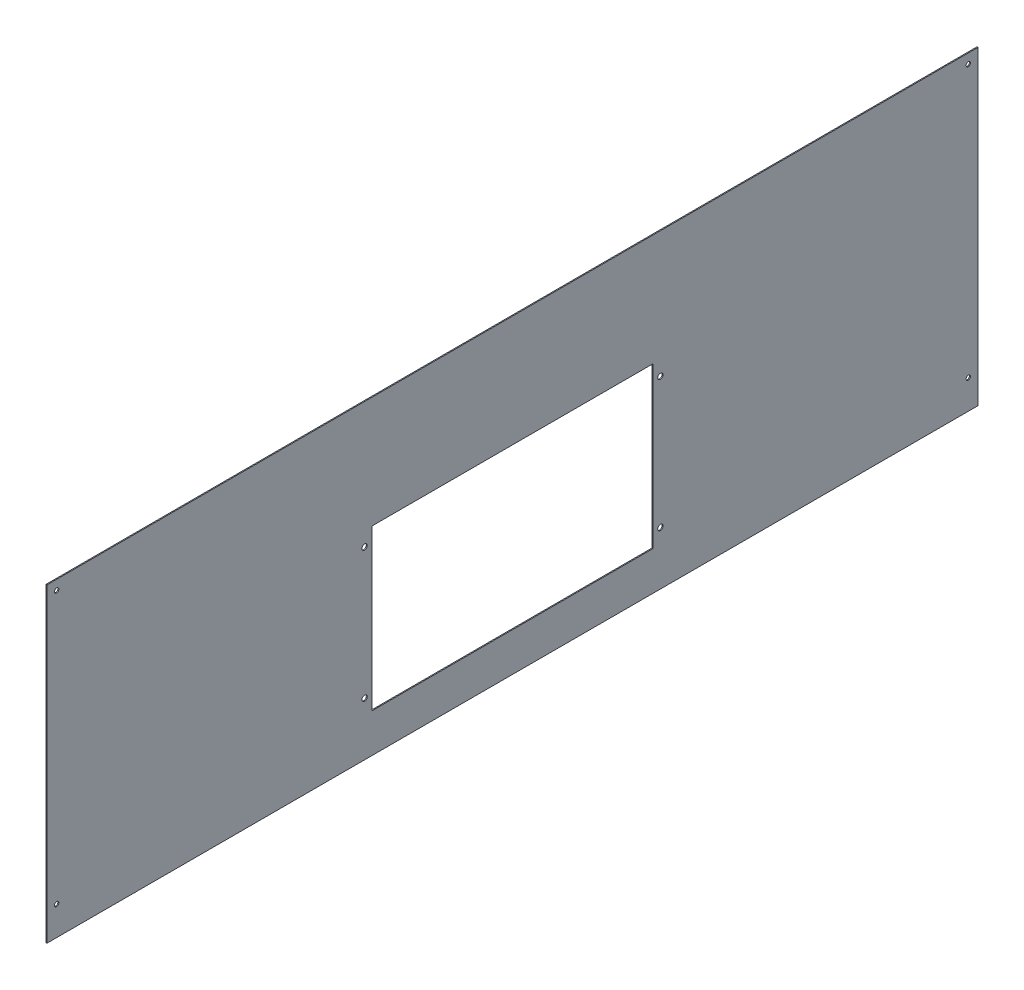
ISO-10303-21;
HEADER;
FILE_DESCRIPTION(('STEP AP214'),'2;1');
FILE_NAME('part.step','',(''),(''),'','','');
FILE_SCHEMA(('AUTOMOTIVE_DESIGN { 1 0 10303 214 1 1 1 1 }'));
ENDSEC;
DATA;
#1=APPLICATION_CONTEXT('core data for automotive mechanical design processes');
#2=APPLICATION_PROTOCOL_DEFINITION('international standard','automotive_design',2000,#1);
#3=PRODUCT_CONTEXT('',#1,'mechanical');
#4=PRODUCT('Part','Part','',(#3));
#5=PRODUCT_RELATED_PRODUCT_CATEGORY('part','',(#4));
#6=PRODUCT_DEFINITION_FORMATION('','',#4);
#7=PRODUCT_DEFINITION_CONTEXT('part definition',#1,'design');
#8=PRODUCT_DEFINITION('design','',#6,#7);
#9=PRODUCT_DEFINITION_SHAPE('','',#8);
#10=(LENGTH_UNIT() NAMED_UNIT(*) SI_UNIT(.MILLI.,.METRE.));
#11=(NAMED_UNIT(*) PLANE_ANGLE_UNIT() SI_UNIT($,.RADIAN.));
#12=(NAMED_UNIT(*) SI_UNIT($,.STERADIAN.) SOLID_ANGLE_UNIT());
#13=UNCERTAINTY_MEASURE_WITH_UNIT(LENGTH_MEASURE(1.E-05),#10,'distance_accuracy_value','');
#14=(GEOMETRIC_REPRESENTATION_CONTEXT(3) GLOBAL_UNCERTAINTY_ASSIGNED_CONTEXT((#13)) GLOBAL_UNIT_ASSIGNED_CONTEXT((#10,
#11,#12)) REPRESENTATION_CONTEXT('',''));
#15=CARTESIAN_POINT('',(0.,0.,0.));
#16=DIRECTION('',(0.,0.,1.));
#17=DIRECTION('',(1.,0.,0.));
#18=AXIS2_PLACEMENT_3D('',#15,#16,#17);
#19=CARTESIAN_POINT('',(0.,-320.,960.));
#20=DIRECTION('',(0.,0.,-1.));
#21=DIRECTION('',(0.,-1.,0.));
#22=AXIS2_PLACEMENT_3D('',#19,#20,#21);
#23=PLANE('',#22);
#24=DIRECTION('',(1.,0.,0.));
#25=VECTOR('',#24,1.);
#26=CARTESIAN_POINT('',(0.,320.,960.));
#27=LINE('',#26,#25);
#28=CARTESIAN_POINT('',(0.,320.,960.));
#29=VERTEX_POINT('',#28);
#30=CARTESIAN_POINT('',(2.,320.,960.));
#31=VERTEX_POINT('',#30);
#32=EDGE_CURVE('E11',#29,#31,#27,.T.);
#33=ORIENTED_EDGE('',*,*,#32,.F.);
#34=DIRECTION('',(0.,-1.,0.));
#35=VECTOR('',#34,1.);
#36=CARTESIAN_POINT('',(0.,-320.,960.));
#37=LINE('',#36,#35);
#38=CARTESIAN_POINT('',(0.,-320.,960.));
#39=VERTEX_POINT('',#38);
#40=EDGE_CURVE('E244',#29,#39,#37,.T.);
#41=ORIENTED_EDGE('',*,*,#40,.T.);
#42=DIRECTION('',(1.,0.,0.));
#43=VECTOR('',#42,1.);
#44=CARTESIAN_POINT('',(0.,-320.,960.));
#45=LINE('',#44,#43);
#46=CARTESIAN_POINT('',(2.,-320.,960.));
#47=VERTEX_POINT('',#46);
#48=EDGE_CURVE('E60',#39,#47,#45,.T.);
#49=ORIENTED_EDGE('',*,*,#48,.T.);
#50=DIRECTION('',(0.,1.,0.));
#51=VECTOR('',#50,1.);
#52=CARTESIAN_POINT('',(2.,0.,960.));
#53=LINE('',#52,#51);
#54=EDGE_CURVE('E185',#31,#47,#53,.F.);
#55=ORIENTED_EDGE('',*,*,#54,.F.);
#56=EDGE_LOOP('',(#33,#41,#49,#55));
#57=FACE_BOUND('',#56,.T.);
#58=ADVANCED_FACE('F49',(#57),#23,.F.);
#59=CARTESIAN_POINT('',(0.,-320.,960.));
#60=DIRECTION('',(0.,1.,0.));
#61=DIRECTION('',(0.,0.,-1.));
#62=AXIS2_PLACEMENT_3D('',#59,#60,#61);
#63=PLANE('',#62);
#64=ORIENTED_EDGE('',*,*,#48,.F.);
#65=DIRECTION('',(0.,0.,-1.));
#66=VECTOR('',#65,1.);
#67=CARTESIAN_POINT('',(0.,-320.,960.));
#68=LINE('',#67,#66);
#69=CARTESIAN_POINT('',(0.,-320.,-960.));
#70=VERTEX_POINT('',#69);
#71=EDGE_CURVE('E247',#39,#70,#68,.T.);
#72=ORIENTED_EDGE('',*,*,#71,.T.);
#73=DIRECTION('',(1.,0.,0.));
#74=VECTOR('',#73,1.);
#75=CARTESIAN_POINT('',(0.,-320.,-960.));
#76=LINE('',#75,#74);
#77=CARTESIAN_POINT('',(2.,-320.,-960.));
#78=VERTEX_POINT('',#77);
#79=EDGE_CURVE('E68',#70,#78,#76,.T.);
#80=ORIENTED_EDGE('',*,*,#79,.T.);
#81=DIRECTION('',(0.,0.,1.));
#82=VECTOR('',#81,1.);
#83=CARTESIAN_POINT('',(2.,-320.,0.));
#84=LINE('',#83,#82);
#85=EDGE_CURVE('E181',#47,#78,#84,.F.);
#86=ORIENTED_EDGE('',*,*,#85,.F.);
#87=EDGE_LOOP('',(#64,#72,#80,#86));
#88=FACE_BOUND('',#87,.T.);
#89=ADVANCED_FACE('F266',(#88),#63,.F.);
#90=CARTESIAN_POINT('',(0.,-320.,-960.));
#91=DIRECTION('',(0.,0.,1.));
#92=DIRECTION('',(0.,1.,0.));
#93=AXIS2_PLACEMENT_3D('',#90,#91,#92);
#94=PLANE('',#93);
#95=ORIENTED_EDGE('',*,*,#79,.F.);
#96=DIRECTION('',(0.,1.,0.));
#97=VECTOR('',#96,1.);
#98=CARTESIAN_POINT('',(0.,-320.,-960.));
#99=LINE('',#98,#97);
#100=CARTESIAN_POINT('',(0.,320.,-960.));
#101=VERTEX_POINT('',#100);
#102=EDGE_CURVE('E237',#70,#101,#99,.T.);
#103=ORIENTED_EDGE('',*,*,#102,.T.);
#104=DIRECTION('',(1.,0.,0.));
#105=VECTOR('',#104,1.);
#106=CARTESIAN_POINT('',(0.,320.,-960.));
#107=LINE('',#106,#105);
#108=CARTESIAN_POINT('',(2.,320.,-960.));
#109=VERTEX_POINT('',#108);
#110=EDGE_CURVE('E53',#101,#109,#107,.T.);
#111=ORIENTED_EDGE('',*,*,#110,.T.);
#112=DIRECTION('',(0.,1.,0.));
#113=VECTOR('',#112,1.);
#114=CARTESIAN_POINT('',(2.,0.,-960.));
#115=LINE('',#114,#113);
#116=EDGE_CURVE('E176',#78,#109,#115,.T.);
#117=ORIENTED_EDGE('',*,*,#116,.F.);
#118=EDGE_LOOP('',(#95,#103,#111,#117));
#119=FACE_BOUND('',#118,.T.);
#120=ADVANCED_FACE('F268',(#119),#94,.F.);
#121=CARTESIAN_POINT('',(0.,-240.,-290.));
#122=DIRECTION('',(0.,0.,1.));
#123=DIRECTION('',(0.,1.,0.));
#124=AXIS2_PLACEMENT_3D('',#121,#122,#123);
#125=PLANE('',#124);
#126=DIRECTION('',(1.,0.,0.));
#127=VECTOR('',#126,1.);
#128=CARTESIAN_POINT('',(0.,90.,-290.));
#129=LINE('',#128,#127);
#130=CARTESIAN_POINT('',(0.,90.,-290.));
#131=VERTEX_POINT('',#130);
#132=CARTESIAN_POINT('',(2.,90.,-290.));
#133=VERTEX_POINT('',#132);
#134=EDGE_CURVE('E117',#131,#133,#129,.T.);
#135=ORIENTED_EDGE('',*,*,#134,.F.);
#136=DIRECTION('',(0.,1.,0.));
#137=VECTOR('',#136,1.);
#138=CARTESIAN_POINT('',(0.,-240.,-290.));
#139=LINE('',#138,#137);
#140=CARTESIAN_POINT('',(0.,-240.,-290.));
#141=VERTEX_POINT('',#140);
#142=EDGE_CURVE('E211',#141,#131,#139,.T.);
#143=ORIENTED_EDGE('',*,*,#142,.F.);
#144=DIRECTION('',(1.,0.,0.));
#145=VECTOR('',#144,1.);
#146=CARTESIAN_POINT('',(0.,-240.,-290.));
#147=LINE('',#146,#145);
#148=CARTESIAN_POINT('',(2.,-240.,-290.));
#149=VERTEX_POINT('',#148);
#150=EDGE_CURVE('E134',#141,#149,#147,.T.);
#151=ORIENTED_EDGE('',*,*,#150,.T.);
#152=DIRECTION('',(0.,1.,0.));
#153=VECTOR('',#152,1.);
#154=CARTESIAN_POINT('',(2.,0.,-290.));
#155=LINE('',#154,#153);
#156=EDGE_CURVE('E147',#149,#133,#155,.T.);
#157=ORIENTED_EDGE('',*,*,#156,.T.);
#158=EDGE_LOOP('',(#135,#143,#151,#157));
#159=FACE_BOUND('',#158,.T.);
#160=ADVANCED_FACE('F274',(#159),#125,.T.);
#161=CARTESIAN_POINT('',(0.,-240.,290.));
#162=DIRECTION('',(0.,1.,0.));
#163=DIRECTION('',(0.,0.,-1.));
#164=AXIS2_PLACEMENT_3D('',#161,#162,#163);
#165=PLANE('',#164);
#166=ORIENTED_EDGE('',*,*,#150,.F.);
#167=DIRECTION('',(0.,0.,-1.));
#168=VECTOR('',#167,1.);
#169=CARTESIAN_POINT('',(0.,-240.,290.));
#170=LINE('',#169,#168);
#171=CARTESIAN_POINT('',(0.,-240.,290.));
#172=VERTEX_POINT('',#171);
#173=EDGE_CURVE('E131',#172,#141,#170,.T.);
#174=ORIENTED_EDGE('',*,*,#173,.F.);
#175=DIRECTION('',(1.,0.,0.));
#176=VECTOR('',#175,1.);
#177=CARTESIAN_POINT('',(0.,-240.,290.));
#178=LINE('',#177,#176);
#179=CARTESIAN_POINT('',(2.,-240.,290.));
#180=VERTEX_POINT('',#179);
#181=EDGE_CURVE('E126',#172,#180,#178,.T.);
#182=ORIENTED_EDGE('',*,*,#181,.T.);
#183=DIRECTION('',(0.,0.,1.));
#184=VECTOR('',#183,1.);
#185=CARTESIAN_POINT('',(2.,-240.,0.));
#186=LINE('',#185,#184);
#187=EDGE_CURVE('E129',#180,#149,#186,.F.);
#188=ORIENTED_EDGE('',*,*,#187,.T.);
#189=EDGE_LOOP('',(#166,#174,#182,#188));
#190=FACE_BOUND('',#189,.T.);
#191=ADVANCED_FACE('F127',(#190),#165,.T.);
#192=CARTESIAN_POINT('',(0.,-240.,290.));
#193=DIRECTION('',(0.,0.,-1.));
#194=DIRECTION('',(0.,-1.,0.));
#195=AXIS2_PLACEMENT_3D('',#192,#193,#194);
#196=PLANE('',#195);
#197=ORIENTED_EDGE('',*,*,#181,.F.);
#198=DIRECTION('',(0.,-1.,0.));
#199=VECTOR('',#198,1.);
#200=CARTESIAN_POINT('',(0.,-240.,290.));
#201=LINE('',#200,#199);
#202=CARTESIAN_POINT('',(0.,90.,290.));
#203=VERTEX_POINT('',#202);
#204=EDGE_CURVE('E204',#203,#172,#201,.T.);
#205=ORIENTED_EDGE('',*,*,#204,.F.);
#206=DIRECTION('',(1.,0.,0.));
#207=VECTOR('',#206,1.);
#208=CARTESIAN_POINT('',(0.,90.,290.));
#209=LINE('',#208,#207);
#210=CARTESIAN_POINT('',(2.,90.,290.));
#211=VERTEX_POINT('',#210);
#212=EDGE_CURVE('E110',#203,#211,#209,.T.);
#213=ORIENTED_EDGE('',*,*,#212,.T.);
#214=DIRECTION('',(0.,1.,0.));
#215=VECTOR('',#214,1.);
#216=CARTESIAN_POINT('',(2.,0.,290.));
#217=LINE('',#216,#215);
#218=EDGE_CURVE('E136',#211,#180,#217,.F.);
#219=ORIENTED_EDGE('',*,*,#218,.T.);
#220=EDGE_LOOP('',(#197,#205,#213,#219));
#221=FACE_BOUND('',#220,.T.);
#222=ADVANCED_FACE('F137',(#221),#196,.T.);
#223=CARTESIAN_POINT('',(0.,-210.,-305.000000000003));
#224=DIRECTION('',(-1.,0.,0.));
#225=DIRECTION('',(0.,0.,1.));
#226=AXIS2_PLACEMENT_3D('',#223,#224,#225);
#227=CYLINDRICAL_SURFACE('',#226,5.50000000000002);
#228=CARTESIAN_POINT('',(2.,-210.,-305.000000000003));
#229=DIRECTION('',(1.,0.,0.));
#230=DIRECTION('',(0.,0.,-1.));
#231=AXIS2_PLACEMENT_3D('',#228,#229,#230);
#232=CIRCLE('',#231,5.50000000000002);
#233=CARTESIAN_POINT('',(2.,-210.,-310.500000000003));
#234=VERTEX_POINT('',#233);
#235=EDGE_CURVE('E249',#234,#234,#232,.T.);
#236=ORIENTED_EDGE('',*,*,#235,.T.);
#237=EDGE_LOOP('',(#236));
#238=FACE_BOUND('',#237,.T.);
#239=CARTESIAN_POINT('',(0.,-210.,-305.000000000003));
#240=DIRECTION('',(1.,0.,0.));
#241=DIRECTION('',(0.,0.,-1.));
#242=AXIS2_PLACEMENT_3D('',#239,#240,#241);
#243=CIRCLE('',#242,5.50000000000002);
#244=CARTESIAN_POINT('',(0.,-210.,-310.500000000003));
#245=VERTEX_POINT('',#244);
#246=EDGE_CURVE('E192',#245,#245,#243,.T.);
#247=ORIENTED_EDGE('',*,*,#246,.F.);
#248=EDGE_LOOP('',(#247));
#249=FACE_BOUND('',#248,.T.);
#250=ADVANCED_FACE('F308',(#238,#249),#227,.F.);
#251=CARTESIAN_POINT('',(0.,60.0000000000001,-305.));
#252=DIRECTION('',(-1.,0.,0.));
#253=DIRECTION('',(0.,0.,1.));
#254=AXIS2_PLACEMENT_3D('',#251,#252,#253);
#255=CYLINDRICAL_SURFACE('',#254,5.50000000000002);
#256=CARTESIAN_POINT('',(2.,60.0000000000001,-305.));
#257=DIRECTION('',(1.,0.,0.));
#258=DIRECTION('',(0.,0.,-1.));
#259=AXIS2_PLACEMENT_3D('',#256,#257,#258);
#260=CIRCLE('',#259,5.50000000000002);
#261=CARTESIAN_POINT('',(2.,60.0000000000001,-310.5));
#262=VERTEX_POINT('',#261);
#263=EDGE_CURVE('E335',#262,#262,#260,.T.);
#264=ORIENTED_EDGE('',*,*,#263,.T.);
#265=EDGE_LOOP('',(#264));
#266=FACE_BOUND('',#265,.T.);
#267=CARTESIAN_POINT('',(0.,60.0000000000001,-305.));
#268=DIRECTION('',(1.,0.,0.));
#269=DIRECTION('',(0.,0.,-1.));
#270=AXIS2_PLACEMENT_3D('',#267,#268,#269);
#271=CIRCLE('',#270,5.50000000000002);
#272=CARTESIAN_POINT('',(0.,60.0000000000001,-310.5));
#273=VERTEX_POINT('',#272);
#274=EDGE_CURVE('E196',#273,#273,#271,.T.);
#275=ORIENTED_EDGE('',*,*,#274,.F.);
#276=EDGE_LOOP('',(#275));
#277=FACE_BOUND('',#276,.T.);
#278=ADVANCED_FACE('F311',(#266,#277),#255,.F.);
#279=CARTESIAN_POINT('',(0.,60.0000000000001,305.));
#280=DIRECTION('',(-1.,0.,0.));
#281=DIRECTION('',(0.,0.,1.));
#282=AXIS2_PLACEMENT_3D('',#279,#280,#281);
#283=CYLINDRICAL_SURFACE('',#282,5.50000000000002);
#284=CARTESIAN_POINT('',(2.,60.0000000000001,305.));
#285=DIRECTION('',(1.,0.,0.));
#286=DIRECTION('',(0.,0.,-1.));
#287=AXIS2_PLACEMENT_3D('',#284,#285,#286);
#288=CIRCLE('',#287,5.50000000000002);
#289=CARTESIAN_POINT('',(2.,60.0000000000001,299.5));
#290=VERTEX_POINT('',#289);
#291=EDGE_CURVE('E141',#290,#290,#288,.T.);
#292=ORIENTED_EDGE('',*,*,#291,.T.);
#293=EDGE_LOOP('',(#292));
#294=FACE_BOUND('',#293,.T.);
#295=CARTESIAN_POINT('',(0.,60.0000000000001,305.));
#296=DIRECTION('',(1.,0.,0.));
#297=DIRECTION('',(0.,0.,-1.));
#298=AXIS2_PLACEMENT_3D('',#295,#296,#297);
#299=CIRCLE('',#298,5.50000000000002);
#300=CARTESIAN_POINT('',(0.,60.0000000000001,299.5));
#301=VERTEX_POINT('',#300);
#302=EDGE_CURVE('E200',#301,#301,#299,.T.);
#303=ORIENTED_EDGE('',*,*,#302,.F.);
#304=EDGE_LOOP('',(#303));
#305=FACE_BOUND('',#304,.T.);
#306=ADVANCED_FACE('F300',(#294,#305),#283,.F.);
#307=CARTESIAN_POINT('',(0.,90.,290.));
#308=DIRECTION('',(0.,-1.,0.));
#309=DIRECTION('',(0.,0.,1.));
#310=AXIS2_PLACEMENT_3D('',#307,#308,#309);
#311=PLANE('',#310);
#312=DIRECTION('',(0.,0.,1.));
#313=VECTOR('',#312,1.);
#314=CARTESIAN_POINT('',(0.,90.,290.));
#315=LINE('',#314,#313);
#316=EDGE_CURVE('E207',#131,#203,#315,.T.);
#317=ORIENTED_EDGE('',*,*,#316,.F.);
#318=ORIENTED_EDGE('',*,*,#134,.T.);
#319=DIRECTION('',(0.,0.,1.));
#320=VECTOR('',#319,1.);
#321=CARTESIAN_POINT('',(2.,90.,0.));
#322=LINE('',#321,#320);
#323=EDGE_CURVE('E140',#133,#211,#322,.T.);
#324=ORIENTED_EDGE('',*,*,#323,.T.);
#325=ORIENTED_EDGE('',*,*,#212,.F.);
#326=EDGE_LOOP('',(#317,#318,#324,#325));
#327=FACE_BOUND('',#326,.T.);
#328=ADVANCED_FACE('F296',(#327),#311,.T.);
#329=CARTESIAN_POINT('',(0.,-260.,940.));
#330=DIRECTION('',(-1.,0.,0.));
#331=DIRECTION('',(0.,0.,1.));
#332=AXIS2_PLACEMENT_3D('',#329,#330,#331);
#333=CYLINDRICAL_SURFACE('',#332,4.49999999999991);
#334=CARTESIAN_POINT('',(2.,-260.,940.));
#335=DIRECTION('',(1.,0.,0.));
#336=DIRECTION('',(0.,0.,-1.));
#337=AXIS2_PLACEMENT_3D('',#334,#335,#336);
#338=CIRCLE('',#337,4.49999999999991);
#339=CARTESIAN_POINT('',(2.,-260.,935.5));
#340=VERTEX_POINT('',#339);
#341=EDGE_CURVE('E149',#340,#340,#338,.T.);
#342=ORIENTED_EDGE('',*,*,#341,.T.);
#343=EDGE_LOOP('',(#342));
#344=FACE_BOUND('',#343,.T.);
#345=CARTESIAN_POINT('',(0.,-260.,940.));
#346=DIRECTION('',(1.,0.,0.));
#347=DIRECTION('',(0.,0.,-1.));
#348=AXIS2_PLACEMENT_3D('',#345,#346,#347);
#349=CIRCLE('',#348,4.49999999999991);
#350=CARTESIAN_POINT('',(0.,-260.,935.5));
#351=VERTEX_POINT('',#350);
#352=EDGE_CURVE('E217',#351,#351,#349,.T.);
#353=ORIENTED_EDGE('',*,*,#352,.F.);
#354=EDGE_LOOP('',(#353));
#355=FACE_BOUND('',#354,.T.);
#356=ADVANCED_FACE('F292',(#344,#355),#333,.F.);
#357=CARTESIAN_POINT('',(0.,-260.,-940.));
#358=DIRECTION('',(-1.,0.,0.));
#359=DIRECTION('',(0.,0.,1.));
#360=AXIS2_PLACEMENT_3D('',#357,#358,#359);
#361=CYLINDRICAL_SURFACE('',#360,4.49999999999991);
#362=CARTESIAN_POINT('',(2.,-260.,-940.));
#363=DIRECTION('',(1.,0.,0.));
#364=DIRECTION('',(0.,0.,-1.));
#365=AXIS2_PLACEMENT_3D('',#362,#363,#364);
#366=CIRCLE('',#365,4.49999999999991);
#367=CARTESIAN_POINT('',(2.,-260.,-944.5));
#368=VERTEX_POINT('',#367);
#369=EDGE_CURVE('E154',#368,#368,#366,.T.);
#370=ORIENTED_EDGE('',*,*,#369,.T.);
#371=EDGE_LOOP('',(#370));
#372=FACE_BOUND('',#371,.T.);
#373=CARTESIAN_POINT('',(0.,-260.,-940.));
#374=DIRECTION('',(1.,0.,0.));
#375=DIRECTION('',(0.,0.,-1.));
#376=AXIS2_PLACEMENT_3D('',#373,#374,#375);
#377=CIRCLE('',#376,4.49999999999991);
#378=CARTESIAN_POINT('',(0.,-260.,-944.5));
#379=VERTEX_POINT('',#378);
#380=EDGE_CURVE('E221',#379,#379,#377,.T.);
#381=ORIENTED_EDGE('',*,*,#380,.F.);
#382=EDGE_LOOP('',(#381));
#383=FACE_BOUND('',#382,.T.);
#384=ADVANCED_FACE('F288',(#372,#383),#361,.F.);
#385=CARTESIAN_POINT('',(0.,300.,-940.));
#386=DIRECTION('',(-1.,0.,0.));
#387=DIRECTION('',(0.,0.,1.));
#388=AXIS2_PLACEMENT_3D('',#385,#386,#387);
#389=CYLINDRICAL_SURFACE('',#388,4.49999999999991);
#390=CARTESIAN_POINT('',(2.,300.,-940.));
#391=DIRECTION('',(1.,0.,0.));
#392=DIRECTION('',(0.,0.,-1.));
#393=AXIS2_PLACEMENT_3D('',#390,#391,#392);
#394=CIRCLE('',#393,4.49999999999991);
#395=CARTESIAN_POINT('',(2.,300.,-944.5));
#396=VERTEX_POINT('',#395);
#397=EDGE_CURVE('E164',#396,#396,#394,.T.);
#398=ORIENTED_EDGE('',*,*,#397,.T.);
#399=EDGE_LOOP('',(#398));
#400=FACE_BOUND('',#399,.T.);
#401=CARTESIAN_POINT('',(0.,300.,-940.));
#402=DIRECTION('',(1.,0.,0.));
#403=DIRECTION('',(0.,0.,-1.));
#404=AXIS2_PLACEMENT_3D('',#401,#402,#403);
#405=CIRCLE('',#404,4.49999999999991);
#406=CARTESIAN_POINT('',(0.,300.,-944.5));
#407=VERTEX_POINT('',#406);
#408=EDGE_CURVE('E225',#407,#407,#405,.T.);
#409=ORIENTED_EDGE('',*,*,#408,.F.);
#410=EDGE_LOOP('',(#409));
#411=FACE_BOUND('',#410,.T.);
#412=ADVANCED_FACE('F284',(#400,#411),#389,.F.);
#413=CARTESIAN_POINT('',(0.,300.,940.));
#414=DIRECTION('',(-1.,0.,0.));
#415=DIRECTION('',(0.,0.,1.));
#416=AXIS2_PLACEMENT_3D('',#413,#414,#415);
#417=CYLINDRICAL_SURFACE('',#416,4.49999999999991);
#418=CARTESIAN_POINT('',(2.,300.,940.));
#419=DIRECTION('',(1.,0.,0.));
#420=DIRECTION('',(0.,0.,-1.));
#421=AXIS2_PLACEMENT_3D('',#418,#419,#420);
#422=CIRCLE('',#421,4.49999999999991);
#423=CARTESIAN_POINT('',(2.,300.,935.5));
#424=VERTEX_POINT('',#423);
#425=EDGE_CURVE('E168',#424,#424,#422,.T.);
#426=ORIENTED_EDGE('',*,*,#425,.T.);
#427=EDGE_LOOP('',(#426));
#428=FACE_BOUND('',#427,.T.);
#429=CARTESIAN_POINT('',(0.,300.,940.));
#430=DIRECTION('',(1.,0.,0.));
#431=DIRECTION('',(0.,0.,-1.));
#432=AXIS2_PLACEMENT_3D('',#429,#430,#431);
#433=CIRCLE('',#432,4.49999999999991);
#434=CARTESIAN_POINT('',(0.,300.,935.5));
#435=VERTEX_POINT('',#434);
#436=EDGE_CURVE('E229',#435,#435,#433,.T.);
#437=ORIENTED_EDGE('',*,*,#436,.F.);
#438=EDGE_LOOP('',(#437));
#439=FACE_BOUND('',#438,.T.);
#440=ADVANCED_FACE('F280',(#428,#439),#417,.F.);
#441=CARTESIAN_POINT('',(0.,-210.,304.999999999997));
#442=DIRECTION('',(-1.,0.,0.));
#443=DIRECTION('',(0.,0.,1.));
#444=AXIS2_PLACEMENT_3D('',#441,#442,#443);
#445=CYLINDRICAL_SURFACE('',#444,5.50000000000002);
#446=CARTESIAN_POINT('',(2.,-210.,304.999999999997));
#447=DIRECTION('',(1.,0.,0.));
#448=DIRECTION('',(0.,0.,-1.));
#449=AXIS2_PLACEMENT_3D('',#446,#447,#448);
#450=CIRCLE('',#449,5.50000000000002);
#451=CARTESIAN_POINT('',(2.,-210.,299.499999999997));
#452=VERTEX_POINT('',#451);
#453=EDGE_CURVE('E172',#452,#452,#450,.T.);
#454=ORIENTED_EDGE('',*,*,#453,.T.);
#455=EDGE_LOOP('',(#454));
#456=FACE_BOUND('',#455,.T.);
#457=CARTESIAN_POINT('',(0.,-210.,304.999999999997));
#458=DIRECTION('',(1.,0.,0.));
#459=DIRECTION('',(0.,0.,-1.));
#460=AXIS2_PLACEMENT_3D('',#457,#458,#459);
#461=CIRCLE('',#460,5.50000000000002);
#462=CARTESIAN_POINT('',(0.,-210.,299.499999999997));
#463=VERTEX_POINT('',#462);
#464=EDGE_CURVE('E233',#463,#463,#461,.T.);
#465=ORIENTED_EDGE('',*,*,#464,.F.);
#466=EDGE_LOOP('',(#465));
#467=FACE_BOUND('',#466,.T.);
#468=ADVANCED_FACE('F277',(#456,#467),#445,.F.);
#469=CARTESIAN_POINT('',(0.,320.,960.));
#470=DIRECTION('',(0.,-1.,0.));
#471=DIRECTION('',(0.,0.,1.));
#472=AXIS2_PLACEMENT_3D('',#469,#470,#471);
#473=PLANE('',#472);
#474=DIRECTION('',(0.,0.,1.));
#475=VECTOR('',#474,1.);
#476=CARTESIAN_POINT('',(0.,320.,960.));
#477=LINE('',#476,#475);
#478=EDGE_CURVE('E240',#101,#29,#477,.T.);
#479=ORIENTED_EDGE('',*,*,#478,.T.);
#480=ORIENTED_EDGE('',*,*,#32,.T.);
#481=DIRECTION('',(0.,0.,1.));
#482=VECTOR('',#481,1.);
#483=CARTESIAN_POINT('',(2.,320.,0.));
#484=LINE('',#483,#482);
#485=EDGE_CURVE('E180',#109,#31,#484,.T.);
#486=ORIENTED_EDGE('',*,*,#485,.F.);
#487=ORIENTED_EDGE('',*,*,#110,.F.);
#488=EDGE_LOOP('',(#479,#480,#486,#487));
#489=FACE_BOUND('',#488,.T.);
#490=ADVANCED_FACE('F51',(#489),#473,.F.);
#491=CARTESIAN_POINT('',(2.,0.,0.));
#492=DIRECTION('',(-1.,0.,0.));
#493=DIRECTION('',(0.,0.,1.));
#494=AXIS2_PLACEMENT_3D('',#491,#492,#493);
#495=PLANE('',#494);
#496=ORIENTED_EDGE('',*,*,#235,.F.);
#497=EDGE_LOOP('',(#496));
#498=FACE_BOUND('',#497,.T.);
#499=ORIENTED_EDGE('',*,*,#263,.F.);
#500=EDGE_LOOP('',(#499));
#501=FACE_BOUND('',#500,.T.);
#502=ORIENTED_EDGE('',*,*,#291,.F.);
#503=EDGE_LOOP('',(#502));
#504=FACE_BOUND('',#503,.T.);
#505=ORIENTED_EDGE('',*,*,#218,.F.);
#506=ORIENTED_EDGE('',*,*,#323,.F.);
#507=ORIENTED_EDGE('',*,*,#156,.F.);
#508=ORIENTED_EDGE('',*,*,#187,.F.);
#509=EDGE_LOOP('',(#505,#506,#507,#508));
#510=FACE_BOUND('',#509,.T.);
#511=ORIENTED_EDGE('',*,*,#341,.F.);
#512=EDGE_LOOP('',(#511));
#513=FACE_BOUND('',#512,.T.);
#514=ORIENTED_EDGE('',*,*,#369,.F.);
#515=EDGE_LOOP('',(#514));
#516=FACE_BOUND('',#515,.T.);
#517=ORIENTED_EDGE('',*,*,#397,.F.);
#518=EDGE_LOOP('',(#517));
#519=FACE_BOUND('',#518,.T.);
#520=ORIENTED_EDGE('',*,*,#425,.F.);
#521=EDGE_LOOP('',(#520));
#522=FACE_BOUND('',#521,.T.);
#523=ORIENTED_EDGE('',*,*,#453,.F.);
#524=EDGE_LOOP('',(#523));
#525=FACE_BOUND('',#524,.T.);
#526=ORIENTED_EDGE('',*,*,#116,.T.);
#527=ORIENTED_EDGE('',*,*,#485,.T.);
#528=ORIENTED_EDGE('',*,*,#54,.T.);
#529=ORIENTED_EDGE('',*,*,#85,.T.);
#530=EDGE_LOOP('',(#526,#527,#528,#529));
#531=FACE_BOUND('',#530,.T.);
#532=ADVANCED_FACE('F144',(#498,#501,#504,#510,#513,#516,#519,#522,#525,#531),#495,.F.);
#533=CARTESIAN_POINT('',(0.,0.,0.));
#534=DIRECTION('',(-1.,0.,0.));
#535=DIRECTION('',(0.,0.,1.));
#536=AXIS2_PLACEMENT_3D('',#533,#534,#535);
#537=PLANE('',#536);
#538=ORIENTED_EDGE('',*,*,#246,.T.);
#539=EDGE_LOOP('',(#538));
#540=FACE_BOUND('',#539,.T.);
#541=ORIENTED_EDGE('',*,*,#274,.T.);
#542=EDGE_LOOP('',(#541));
#543=FACE_BOUND('',#542,.T.);
#544=ORIENTED_EDGE('',*,*,#302,.T.);
#545=EDGE_LOOP('',(#544));
#546=FACE_BOUND('',#545,.T.);
#547=ORIENTED_EDGE('',*,*,#204,.T.);
#548=ORIENTED_EDGE('',*,*,#173,.T.);
#549=ORIENTED_EDGE('',*,*,#142,.T.);
#550=ORIENTED_EDGE('',*,*,#316,.T.);
#551=EDGE_LOOP('',(#547,#548,#549,#550));
#552=FACE_BOUND('',#551,.T.);
#553=ORIENTED_EDGE('',*,*,#352,.T.);
#554=EDGE_LOOP('',(#553));
#555=FACE_BOUND('',#554,.T.);
#556=ORIENTED_EDGE('',*,*,#380,.T.);
#557=EDGE_LOOP('',(#556));
#558=FACE_BOUND('',#557,.T.);
#559=ORIENTED_EDGE('',*,*,#408,.T.);
#560=EDGE_LOOP('',(#559));
#561=FACE_BOUND('',#560,.T.);
#562=ORIENTED_EDGE('',*,*,#436,.T.);
#563=EDGE_LOOP('',(#562));
#564=FACE_BOUND('',#563,.T.);
#565=ORIENTED_EDGE('',*,*,#464,.T.);
#566=EDGE_LOOP('',(#565));
#567=FACE_BOUND('',#566,.T.);
#568=ORIENTED_EDGE('',*,*,#102,.F.);
#569=ORIENTED_EDGE('',*,*,#71,.F.);
#570=ORIENTED_EDGE('',*,*,#40,.F.);
#571=ORIENTED_EDGE('',*,*,#478,.F.);
#572=EDGE_LOOP('',(#568,#569,#570,#571));
#573=FACE_BOUND('',#572,.T.);
#574=ADVANCED_FACE('F319',(#540,#543,#546,#552,#555,#558,#561,#564,#567,#573),#537,.T.);
#575=CLOSED_SHELL('',(#58,#89,#120,#160,#191,#222,#250,#278,#306,#328,#356,#384,#412,#440,#468,
#490,#532,#574));
#576=MANIFOLD_SOLID_BREP('B2',#575);
#577=ADVANCED_BREP_SHAPE_REPRESENTATION('',(#18,#576),#14);
#578=SHAPE_DEFINITION_REPRESENTATION(#9,#577);
ENDSEC;
END-ISO-10303-21;
